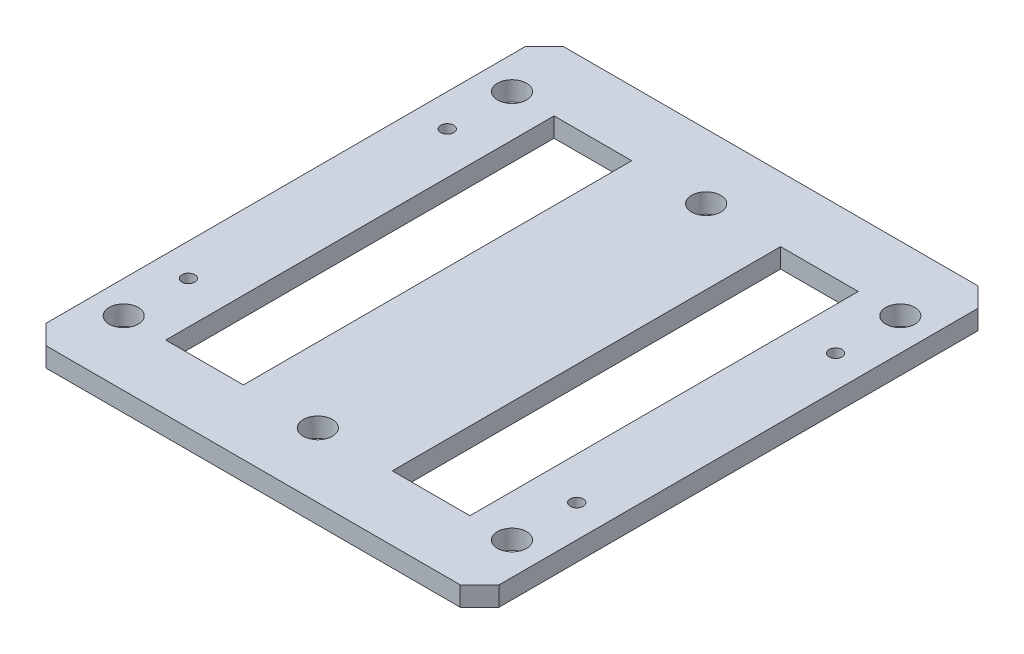
ISO-10303-21;
HEADER;
FILE_DESCRIPTION(('STEP AP214'),'2;1');
FILE_NAME('part.step','',(''),(''),'','','');
FILE_SCHEMA(('AUTOMOTIVE_DESIGN { 1 0 10303 214 1 1 1 1 }'));
ENDSEC;
DATA;
#1=APPLICATION_CONTEXT('core data for automotive mechanical design processes');
#2=APPLICATION_PROTOCOL_DEFINITION('international standard','automotive_design',2000,#1);
#3=PRODUCT_CONTEXT('',#1,'mechanical');
#4=PRODUCT('Part','Part','',(#3));
#5=PRODUCT_RELATED_PRODUCT_CATEGORY('part','',(#4));
#6=PRODUCT_DEFINITION_FORMATION('','',#4);
#7=PRODUCT_DEFINITION_CONTEXT('part definition',#1,'design');
#8=PRODUCT_DEFINITION('design','',#6,#7);
#9=PRODUCT_DEFINITION_SHAPE('','',#8);
#10=(LENGTH_UNIT() NAMED_UNIT(*) SI_UNIT(.MILLI.,.METRE.));
#11=(NAMED_UNIT(*) PLANE_ANGLE_UNIT() SI_UNIT($,.RADIAN.));
#12=(NAMED_UNIT(*) SI_UNIT($,.STERADIAN.) SOLID_ANGLE_UNIT());
#13=UNCERTAINTY_MEASURE_WITH_UNIT(LENGTH_MEASURE(1.E-05),#10,'distance_accuracy_value','');
#14=(GEOMETRIC_REPRESENTATION_CONTEXT(3) GLOBAL_UNCERTAINTY_ASSIGNED_CONTEXT((#13)) GLOBAL_UNIT_ASSIGNED_CONTEXT((#10,
#11,#12)) REPRESENTATION_CONTEXT('',''));
#15=CARTESIAN_POINT('',(0.,0.,0.));
#16=DIRECTION('',(0.,0.,1.));
#17=DIRECTION('',(1.,0.,0.));
#18=AXIS2_PLACEMENT_3D('',#15,#16,#17);
#19=CARTESIAN_POINT('',(0.,0.,80.));
#20=DIRECTION('',(1.,0.,0.));
#21=DIRECTION('',(0.,0.,-1.));
#22=AXIS2_PLACEMENT_3D('',#19,#20,#21);
#23=PLANE('',#22);
#24=DIRECTION('',(0.,-1.,0.));
#25=VECTOR('',#24,1.);
#26=CARTESIAN_POINT('',(0.,0.,3.));
#27=LINE('',#26,#25);
#28=CARTESIAN_POINT('',(0.,12.,3.));
#29=VERTEX_POINT('',#28);
#30=CARTESIAN_POINT('',(0.,9.,3.));
#31=VERTEX_POINT('',#30);
#32=EDGE_CURVE('E199',#29,#31,#27,.T.);
#33=ORIENTED_EDGE('',*,*,#32,.T.);
#34=DIRECTION('',(0.,0.,1.));
#35=VECTOR('',#34,1.);
#36=CARTESIAN_POINT('',(0.,9.,0.));
#37=LINE('',#36,#35);
#38=CARTESIAN_POINT('',(0.,9.,77.));
#39=VERTEX_POINT('',#38);
#40=EDGE_CURVE('E236',#31,#39,#37,.T.);
#41=ORIENTED_EDGE('',*,*,#40,.T.);
#42=DIRECTION('',(0.,1.,0.));
#43=VECTOR('',#42,1.);
#44=CARTESIAN_POINT('',(0.,0.,77.));
#45=LINE('',#44,#43);
#46=CARTESIAN_POINT('',(0.,12.,77.));
#47=VERTEX_POINT('',#46);
#48=EDGE_CURVE('E197',#39,#47,#45,.T.);
#49=ORIENTED_EDGE('',*,*,#48,.T.);
#50=DIRECTION('',(0.,0.,-1.));
#51=VECTOR('',#50,1.);
#52=CARTESIAN_POINT('',(0.,12.,80.));
#53=LINE('',#52,#51);
#54=EDGE_CURVE('E184',#47,#29,#53,.T.);
#55=ORIENTED_EDGE('',*,*,#54,.T.);
#56=EDGE_LOOP('',(#33,#41,#49,#55));
#57=FACE_BOUND('',#56,.T.);
#58=ADVANCED_FACE('F33',(#57),#23,.F.);
#59=CARTESIAN_POINT('',(70.,0.,80.));
#60=DIRECTION('',(-1.,0.,0.));
#61=DIRECTION('',(0.,0.,1.));
#62=AXIS2_PLACEMENT_3D('',#59,#60,#61);
#63=PLANE('',#62);
#64=DIRECTION('',(0.,-1.,0.));
#65=VECTOR('',#64,1.);
#66=CARTESIAN_POINT('',(70.,0.,77.));
#67=LINE('',#66,#65);
#68=CARTESIAN_POINT('',(70.,12.,77.));
#69=VERTEX_POINT('',#68);
#70=CARTESIAN_POINT('',(70.,9.,77.));
#71=VERTEX_POINT('',#70);
#72=EDGE_CURVE('E171',#69,#71,#67,.T.);
#73=ORIENTED_EDGE('',*,*,#72,.T.);
#74=DIRECTION('',(0.,0.,1.));
#75=VECTOR('',#74,1.);
#76=CARTESIAN_POINT('',(70.,9.,0.));
#77=LINE('',#76,#75);
#78=CARTESIAN_POINT('',(70.,9.,3.));
#79=VERTEX_POINT('',#78);
#80=EDGE_CURVE('E152',#79,#71,#77,.T.);
#81=ORIENTED_EDGE('',*,*,#80,.F.);
#82=DIRECTION('',(0.,1.,0.));
#83=VECTOR('',#82,1.);
#84=CARTESIAN_POINT('',(70.,12.,3.));
#85=LINE('',#84,#83);
#86=CARTESIAN_POINT('',(70.,12.,3.));
#87=VERTEX_POINT('',#86);
#88=EDGE_CURVE('E212',#79,#87,#85,.T.);
#89=ORIENTED_EDGE('',*,*,#88,.T.);
#90=DIRECTION('',(0.,0.,-1.));
#91=VECTOR('',#90,1.);
#92=CARTESIAN_POINT('',(70.,12.,80.));
#93=LINE('',#92,#91);
#94=EDGE_CURVE('E188',#69,#87,#93,.T.);
#95=ORIENTED_EDGE('',*,*,#94,.F.);
#96=EDGE_LOOP('',(#73,#81,#89,#95));
#97=FACE_BOUND('',#96,.T.);
#98=ADVANCED_FACE('F217',(#97),#63,.F.);
#99=CARTESIAN_POINT('',(0.,12.,80.));
#100=DIRECTION('',(0.,-1.,0.));
#101=DIRECTION('',(0.,0.,-1.));
#102=AXIS2_PLACEMENT_3D('',#99,#100,#101);
#103=PLANE('',#102);
#104=CARTESIAN_POINT('',(65.,12.,20.));
#105=DIRECTION('',(0.,1.,0.));
#106=DIRECTION('',(0.,0.,-1.));
#107=AXIS2_PLACEMENT_3D('',#104,#105,#106);
#108=CIRCLE('',#107,0.999999999999998);
#109=CARTESIAN_POINT('',(65.,12.,19.));
#110=VERTEX_POINT('',#109);
#111=EDGE_CURVE('E281',#110,#110,#108,.T.);
#112=ORIENTED_EDGE('',*,*,#111,.F.);
#113=EDGE_LOOP('',(#112));
#114=FACE_BOUND('',#113,.T.);
#115=CARTESIAN_POINT('',(65.,12.,60.));
#116=DIRECTION('',(0.,1.,0.));
#117=DIRECTION('',(0.,0.,1.));
#118=AXIS2_PLACEMENT_3D('',#115,#116,#117);
#119=CIRCLE('',#118,0.999999999999998);
#120=CARTESIAN_POINT('',(65.,12.,61.));
#121=VERTEX_POINT('',#120);
#122=EDGE_CURVE('E284',#121,#121,#119,.T.);
#123=ORIENTED_EDGE('',*,*,#122,.F.);
#124=EDGE_LOOP('',(#123));
#125=FACE_BOUND('',#124,.T.);
#126=CARTESIAN_POINT('',(5.,12.,60.));
#127=DIRECTION('',(0.,1.,0.));
#128=DIRECTION('',(0.,0.,-1.));
#129=AXIS2_PLACEMENT_3D('',#126,#127,#128);
#130=CIRCLE('',#129,1.);
#131=CARTESIAN_POINT('',(5.,12.,59.));
#132=VERTEX_POINT('',#131);
#133=EDGE_CURVE('E287',#132,#132,#130,.T.);
#134=ORIENTED_EDGE('',*,*,#133,.F.);
#135=EDGE_LOOP('',(#134));
#136=FACE_BOUND('',#135,.T.);
#137=CARTESIAN_POINT('',(5.,12.,20.));
#138=DIRECTION('',(0.,1.,0.));
#139=DIRECTION('',(0.,0.,1.));
#140=AXIS2_PLACEMENT_3D('',#137,#138,#139);
#141=CIRCLE('',#140,1.);
#142=CARTESIAN_POINT('',(5.,12.,21.));
#143=VERTEX_POINT('',#142);
#144=EDGE_CURVE('E290',#143,#143,#141,.T.);
#145=ORIENTED_EDGE('',*,*,#144,.F.);
#146=EDGE_LOOP('',(#145));
#147=FACE_BOUND('',#146,.T.);
#148=DIRECTION('',(1.,0.,0.));
#149=VECTOR('',#148,1.);
#150=CARTESIAN_POINT('',(11.5,12.,9.99999999999999));
#151=LINE('',#150,#149);
#152=CARTESIAN_POINT('',(11.5,12.,9.99999999999999));
#153=VERTEX_POINT('',#152);
#154=CARTESIAN_POINT('',(23.5,12.,9.99999999999999));
#155=VERTEX_POINT('',#154);
#156=EDGE_CURVE('E293',#153,#155,#151,.T.);
#157=ORIENTED_EDGE('',*,*,#156,.T.);
#158=DIRECTION('',(0.,0.,1.));
#159=VECTOR('',#158,1.);
#160=CARTESIAN_POINT('',(23.5,12.,0.));
#161=LINE('',#160,#159);
#162=CARTESIAN_POINT('',(23.5,12.,70.));
#163=VERTEX_POINT('',#162);
#164=EDGE_CURVE('E193',#155,#163,#161,.T.);
#165=ORIENTED_EDGE('',*,*,#164,.T.);
#166=DIRECTION('',(-1.,0.,0.));
#167=VECTOR('',#166,1.);
#168=CARTESIAN_POINT('',(11.5,12.,70.));
#169=LINE('',#168,#167);
#170=CARTESIAN_POINT('',(11.5,12.,70.));
#171=VERTEX_POINT('',#170);
#172=EDGE_CURVE('E313',#163,#171,#169,.T.);
#173=ORIENTED_EDGE('',*,*,#172,.T.);
#174=DIRECTION('',(0.,0.,1.));
#175=VECTOR('',#174,1.);
#176=CARTESIAN_POINT('',(11.5,12.,0.));
#177=LINE('',#176,#175);
#178=EDGE_CURVE('E190',#153,#171,#177,.T.);
#179=ORIENTED_EDGE('',*,*,#178,.F.);
#180=EDGE_LOOP('',(#157,#165,#173,#179));
#181=FACE_BOUND('',#180,.T.);
#182=DIRECTION('',(1.,0.,0.));
#183=VECTOR('',#182,1.);
#184=CARTESIAN_POINT('',(58.5,12.,9.99999999999999));
#185=LINE('',#184,#183);
#186=CARTESIAN_POINT('',(46.5,12.,9.99999999999999));
#187=VERTEX_POINT('',#186);
#188=CARTESIAN_POINT('',(58.5,12.,9.99999999999999));
#189=VERTEX_POINT('',#188);
#190=EDGE_CURVE('E299',#187,#189,#185,.T.);
#191=ORIENTED_EDGE('',*,*,#190,.T.);
#192=DIRECTION('',(0.,0.,1.));
#193=VECTOR('',#192,1.);
#194=CARTESIAN_POINT('',(58.5,12.,0.));
#195=LINE('',#194,#193);
#196=CARTESIAN_POINT('',(58.5,12.,70.));
#197=VERTEX_POINT('',#196);
#198=EDGE_CURVE('E340',#189,#197,#195,.T.);
#199=ORIENTED_EDGE('',*,*,#198,.T.);
#200=DIRECTION('',(-1.,0.,0.));
#201=VECTOR('',#200,1.);
#202=CARTESIAN_POINT('',(58.5,12.,70.));
#203=LINE('',#202,#201);
#204=CARTESIAN_POINT('',(46.5,12.,70.));
#205=VERTEX_POINT('',#204);
#206=EDGE_CURVE('E306',#197,#205,#203,.T.);
#207=ORIENTED_EDGE('',*,*,#206,.T.);
#208=DIRECTION('',(0.,0.,1.));
#209=VECTOR('',#208,1.);
#210=CARTESIAN_POINT('',(46.5,12.,0.));
#211=LINE('',#210,#209);
#212=EDGE_CURVE('E339',#187,#205,#211,.T.);
#213=ORIENTED_EDGE('',*,*,#212,.F.);
#214=EDGE_LOOP('',(#191,#199,#207,#213));
#215=FACE_BOUND('',#214,.T.);
#216=CARTESIAN_POINT('',(5.,12.,70.));
#217=DIRECTION('',(0.,1.,0.));
#218=DIRECTION('',(0.,0.,-1.));
#219=AXIS2_PLACEMENT_3D('',#216,#217,#218);
#220=CIRCLE('',#219,2.25);
#221=CARTESIAN_POINT('',(5.,12.,67.75));
#222=VERTEX_POINT('',#221);
#223=EDGE_CURVE('E327',#222,#222,#220,.T.);
#224=ORIENTED_EDGE('',*,*,#223,.F.);
#225=EDGE_LOOP('',(#224));
#226=FACE_BOUND('',#225,.T.);
#227=CARTESIAN_POINT('',(5.,12.,10.));
#228=DIRECTION('',(0.,1.,0.));
#229=DIRECTION('',(0.,0.,1.));
#230=AXIS2_PLACEMENT_3D('',#227,#228,#229);
#231=CIRCLE('',#230,2.25);
#232=CARTESIAN_POINT('',(5.,12.,12.25));
#233=VERTEX_POINT('',#232);
#234=EDGE_CURVE('E336',#233,#233,#231,.T.);
#235=ORIENTED_EDGE('',*,*,#234,.F.);
#236=EDGE_LOOP('',(#235));
#237=FACE_BOUND('',#236,.T.);
#238=DIRECTION('',(-1.,0.,0.));
#239=VECTOR('',#238,1.);
#240=CARTESIAN_POINT('',(0.,12.,0.));
#241=LINE('',#240,#239);
#242=CARTESIAN_POINT('',(67.,12.,0.));
#243=VERTEX_POINT('',#242);
#244=CARTESIAN_POINT('',(3.00000000000002,12.,0.));
#245=VERTEX_POINT('',#244);
#246=EDGE_CURVE('E185',#243,#245,#241,.T.);
#247=ORIENTED_EDGE('',*,*,#246,.T.);
#248=DIRECTION('',(-0.707106781186549,0.,0.707106781186546));
#249=VECTOR('',#248,1.);
#250=CARTESIAN_POINT('',(0.,12.,3.));
#251=LINE('',#250,#249);
#252=EDGE_CURVE('E209',#245,#29,#251,.T.);
#253=ORIENTED_EDGE('',*,*,#252,.T.);
#254=ORIENTED_EDGE('',*,*,#54,.F.);
#255=DIRECTION('',(-0.707106781186546,0.,-0.707106781186549));
#256=VECTOR('',#255,1.);
#257=CARTESIAN_POINT('',(3.,12.,80.));
#258=LINE('',#257,#256);
#259=CARTESIAN_POINT('',(3.,12.,80.));
#260=VERTEX_POINT('',#259);
#261=EDGE_CURVE('E176',#47,#260,#258,.F.);
#262=ORIENTED_EDGE('',*,*,#261,.T.);
#263=DIRECTION('',(-1.,0.,0.));
#264=VECTOR('',#263,1.);
#265=CARTESIAN_POINT('',(0.,12.,80.));
#266=LINE('',#265,#264);
#267=CARTESIAN_POINT('',(67.,12.,80.));
#268=VERTEX_POINT('',#267);
#269=EDGE_CURVE('E178',#268,#260,#266,.T.);
#270=ORIENTED_EDGE('',*,*,#269,.F.);
#271=DIRECTION('',(-0.707106781186546,0.,0.707106781186549));
#272=VECTOR('',#271,1.);
#273=CARTESIAN_POINT('',(67.,12.,80.));
#274=LINE('',#273,#272);
#275=EDGE_CURVE('E169',#268,#69,#274,.F.);
#276=ORIENTED_EDGE('',*,*,#275,.T.);
#277=ORIENTED_EDGE('',*,*,#94,.T.);
#278=DIRECTION('',(-0.707106781186549,0.,-0.707106781186546));
#279=VECTOR('',#278,1.);
#280=CARTESIAN_POINT('',(70.,12.,3.));
#281=LINE('',#280,#279);
#282=EDGE_CURVE('E175',#87,#243,#281,.T.);
#283=ORIENTED_EDGE('',*,*,#282,.T.);
#284=EDGE_LOOP('',(#247,#253,#254,#262,#270,#276,#277,#283));
#285=FACE_BOUND('',#284,.T.);
#286=CARTESIAN_POINT('',(35.,12.,70.));
#287=DIRECTION('',(0.,1.,0.));
#288=DIRECTION('',(0.,0.,1.));
#289=AXIS2_PLACEMENT_3D('',#286,#287,#288);
#290=CIRCLE('',#289,2.25);
#291=CARTESIAN_POINT('',(35.,12.,72.25));
#292=VERTEX_POINT('',#291);
#293=EDGE_CURVE('E320',#292,#292,#290,.T.);
#294=ORIENTED_EDGE('',*,*,#293,.F.);
#295=EDGE_LOOP('',(#294));
#296=FACE_BOUND('',#295,.T.);
#297=CARTESIAN_POINT('',(35.,12.,10.));
#298=DIRECTION('',(0.,1.,0.));
#299=DIRECTION('',(0.,0.,1.));
#300=AXIS2_PLACEMENT_3D('',#297,#298,#299);
#301=CIRCLE('',#300,2.25);
#302=CARTESIAN_POINT('',(35.,12.,12.25));
#303=VERTEX_POINT('',#302);
#304=EDGE_CURVE('E324',#303,#303,#301,.T.);
#305=ORIENTED_EDGE('',*,*,#304,.F.);
#306=EDGE_LOOP('',(#305));
#307=FACE_BOUND('',#306,.T.);
#308=CARTESIAN_POINT('',(65.,12.,10.));
#309=DIRECTION('',(0.,1.,0.));
#310=DIRECTION('',(0.,0.,-1.));
#311=AXIS2_PLACEMENT_3D('',#308,#309,#310);
#312=CIRCLE('',#311,2.25);
#313=CARTESIAN_POINT('',(65.,12.,7.75000000000001));
#314=VERTEX_POINT('',#313);
#315=EDGE_CURVE('E330',#314,#314,#312,.T.);
#316=ORIENTED_EDGE('',*,*,#315,.F.);
#317=EDGE_LOOP('',(#316));
#318=FACE_BOUND('',#317,.T.);
#319=CARTESIAN_POINT('',(65.,12.,70.));
#320=DIRECTION('',(0.,1.,0.));
#321=DIRECTION('',(0.,0.,1.));
#322=AXIS2_PLACEMENT_3D('',#319,#320,#321);
#323=CIRCLE('',#322,2.25);
#324=CARTESIAN_POINT('',(65.,12.,72.25));
#325=VERTEX_POINT('',#324);
#326=EDGE_CURVE('E333',#325,#325,#323,.T.);
#327=ORIENTED_EDGE('',*,*,#326,.F.);
#328=EDGE_LOOP('',(#327));
#329=FACE_BOUND('',#328,.T.);
#330=ADVANCED_FACE('F180',(#114,#125,#136,#147,#181,#215,#226,#237,#285,#296,#307,#318,#329),
#103,.F.);
#331=CARTESIAN_POINT('',(0.,0.,80.));
#332=DIRECTION('',(0.,0.,-1.));
#333=DIRECTION('',(-1.,0.,0.));
#334=AXIS2_PLACEMENT_3D('',#331,#332,#333);
#335=PLANE('',#334);
#336=DIRECTION('',(0.,-1.,0.));
#337=VECTOR('',#336,1.);
#338=CARTESIAN_POINT('',(3.,0.,80.));
#339=LINE('',#338,#337);
#340=CARTESIAN_POINT('',(3.,9.,80.));
#341=VERTEX_POINT('',#340);
#342=EDGE_CURVE('E42',#260,#341,#339,.T.);
#343=ORIENTED_EDGE('',*,*,#342,.T.);
#344=DIRECTION('',(-1.,0.,0.));
#345=VECTOR('',#344,1.);
#346=CARTESIAN_POINT('',(0.,9.,80.));
#347=LINE('',#346,#345);
#348=CARTESIAN_POINT('',(67.,9.,80.));
#349=VERTEX_POINT('',#348);
#350=EDGE_CURVE('E149',#349,#341,#347,.T.);
#351=ORIENTED_EDGE('',*,*,#350,.F.);
#352=DIRECTION('',(0.,1.,0.));
#353=VECTOR('',#352,1.);
#354=CARTESIAN_POINT('',(67.,0.,80.));
#355=LINE('',#354,#353);
#356=EDGE_CURVE('E11',#349,#268,#355,.T.);
#357=ORIENTED_EDGE('',*,*,#356,.T.);
#358=ORIENTED_EDGE('',*,*,#269,.T.);
#359=EDGE_LOOP('',(#343,#351,#357,#358));
#360=FACE_BOUND('',#359,.T.);
#361=ADVANCED_FACE('F162',(#360),#335,.F.);
#362=CARTESIAN_POINT('',(0.,0.,0.));
#363=DIRECTION('',(0.,0.,-1.));
#364=DIRECTION('',(-1.,0.,0.));
#365=AXIS2_PLACEMENT_3D('',#362,#363,#364);
#366=PLANE('',#365);
#367=DIRECTION('',(-1.,0.,0.));
#368=VECTOR('',#367,1.);
#369=CARTESIAN_POINT('',(0.,9.,0.));
#370=LINE('',#369,#368);
#371=CARTESIAN_POINT('',(67.,9.,0.));
#372=VERTEX_POINT('',#371);
#373=CARTESIAN_POINT('',(3.00000000000002,9.,0.));
#374=VERTEX_POINT('',#373);
#375=EDGE_CURVE('E166',#372,#374,#370,.T.);
#376=ORIENTED_EDGE('',*,*,#375,.T.);
#377=DIRECTION('',(0.,1.,0.));
#378=VECTOR('',#377,1.);
#379=CARTESIAN_POINT('',(3.00000000000002,12.,0.));
#380=LINE('',#379,#378);
#381=EDGE_CURVE('E205',#374,#245,#380,.T.);
#382=ORIENTED_EDGE('',*,*,#381,.T.);
#383=ORIENTED_EDGE('',*,*,#246,.F.);
#384=DIRECTION('',(0.,-1.,0.));
#385=VECTOR('',#384,1.);
#386=CARTESIAN_POINT('',(67.,0.,0.));
#387=LINE('',#386,#385);
#388=EDGE_CURVE('E202',#243,#372,#387,.T.);
#389=ORIENTED_EDGE('',*,*,#388,.T.);
#390=EDGE_LOOP('',(#376,#382,#383,#389));
#391=FACE_BOUND('',#390,.T.);
#392=ADVANCED_FACE('F226',(#391),#366,.T.);
#393=CARTESIAN_POINT('',(23.5,12.,0.));
#394=DIRECTION('',(1.,0.,0.));
#395=DIRECTION('',(0.,1.,0.));
#396=AXIS2_PLACEMENT_3D('',#393,#394,#395);
#397=PLANE('',#396);
#398=DIRECTION('',(0.,1.,0.));
#399=VECTOR('',#398,1.);
#400=CARTESIAN_POINT('',(23.5,6.,9.99999999999999));
#401=LINE('',#400,#399);
#402=CARTESIAN_POINT('',(23.5,9.,9.99999999999999));
#403=VERTEX_POINT('',#402);
#404=EDGE_CURVE('E297',#403,#155,#401,.T.);
#405=ORIENTED_EDGE('',*,*,#404,.F.);
#406=DIRECTION('',(0.,0.,1.));
#407=VECTOR('',#406,1.);
#408=CARTESIAN_POINT('',(23.5,9.,0.));
#409=LINE('',#408,#407);
#410=CARTESIAN_POINT('',(23.5,9.,70.));
#411=VERTEX_POINT('',#410);
#412=EDGE_CURVE('E57',#403,#411,#409,.T.);
#413=ORIENTED_EDGE('',*,*,#412,.T.);
#414=DIRECTION('',(0.,1.,0.));
#415=VECTOR('',#414,1.);
#416=CARTESIAN_POINT('',(23.5,6.,70.));
#417=LINE('',#416,#415);
#418=EDGE_CURVE('E317',#411,#163,#417,.T.);
#419=ORIENTED_EDGE('',*,*,#418,.T.);
#420=ORIENTED_EDGE('',*,*,#164,.F.);
#421=EDGE_LOOP('',(#405,#413,#419,#420));
#422=FACE_BOUND('',#421,.T.);
#423=ADVANCED_FACE('F364',(#422),#397,.F.);
#424=CARTESIAN_POINT('',(11.5,12.,0.));
#425=DIRECTION('',(-1.,0.,0.));
#426=DIRECTION('',(0.,0.,1.));
#427=AXIS2_PLACEMENT_3D('',#424,#425,#426);
#428=PLANE('',#427);
#429=DIRECTION('',(0.,1.,0.));
#430=VECTOR('',#429,1.);
#431=CARTESIAN_POINT('',(11.5,6.,70.));
#432=LINE('',#431,#430);
#433=CARTESIAN_POINT('',(11.5,9.,70.));
#434=VERTEX_POINT('',#433);
#435=EDGE_CURVE('E318',#434,#171,#432,.T.);
#436=ORIENTED_EDGE('',*,*,#435,.F.);
#437=DIRECTION('',(0.,0.,-1.));
#438=VECTOR('',#437,1.);
#439=CARTESIAN_POINT('',(11.5,9.,0.));
#440=LINE('',#439,#438);
#441=CARTESIAN_POINT('',(11.5,9.,9.99999999999999));
#442=VERTEX_POINT('',#441);
#443=EDGE_CURVE('E249',#434,#442,#440,.T.);
#444=ORIENTED_EDGE('',*,*,#443,.T.);
#445=DIRECTION('',(0.,1.,0.));
#446=VECTOR('',#445,1.);
#447=CARTESIAN_POINT('',(11.5,6.,9.99999999999999));
#448=LINE('',#447,#446);
#449=EDGE_CURVE('E296',#442,#153,#448,.T.);
#450=ORIENTED_EDGE('',*,*,#449,.T.);
#451=ORIENTED_EDGE('',*,*,#178,.T.);
#452=EDGE_LOOP('',(#436,#444,#450,#451));
#453=FACE_BOUND('',#452,.T.);
#454=ADVANCED_FACE('F360',(#453),#428,.F.);
#455=CARTESIAN_POINT('',(58.5,12.,0.));
#456=DIRECTION('',(1.,0.,0.));
#457=DIRECTION('',(0.,0.,-1.));
#458=AXIS2_PLACEMENT_3D('',#455,#456,#457);
#459=PLANE('',#458);
#460=DIRECTION('',(0.,1.,0.));
#461=VECTOR('',#460,1.);
#462=CARTESIAN_POINT('',(58.5,6.,9.99999999999999));
#463=LINE('',#462,#461);
#464=CARTESIAN_POINT('',(58.5,9.,9.99999999999999));
#465=VERTEX_POINT('',#464);
#466=EDGE_CURVE('E304',#465,#189,#463,.T.);
#467=ORIENTED_EDGE('',*,*,#466,.F.);
#468=DIRECTION('',(0.,0.,1.));
#469=VECTOR('',#468,1.);
#470=CARTESIAN_POINT('',(58.5,9.,0.));
#471=LINE('',#470,#469);
#472=CARTESIAN_POINT('',(58.5,9.,70.));
#473=VERTEX_POINT('',#472);
#474=EDGE_CURVE('E49',#465,#473,#471,.T.);
#475=ORIENTED_EDGE('',*,*,#474,.T.);
#476=DIRECTION('',(0.,1.,0.));
#477=VECTOR('',#476,1.);
#478=CARTESIAN_POINT('',(58.5,6.,70.));
#479=LINE('',#478,#477);
#480=EDGE_CURVE('E310',#473,#197,#479,.T.);
#481=ORIENTED_EDGE('',*,*,#480,.T.);
#482=ORIENTED_EDGE('',*,*,#198,.F.);
#483=EDGE_LOOP('',(#467,#475,#481,#482));
#484=FACE_BOUND('',#483,.T.);
#485=ADVANCED_FACE('F371',(#484),#459,.F.);
#486=CARTESIAN_POINT('',(46.5,12.,0.));
#487=DIRECTION('',(-1.,0.,0.));
#488=DIRECTION('',(0.,0.,1.));
#489=AXIS2_PLACEMENT_3D('',#486,#487,#488);
#490=PLANE('',#489);
#491=DIRECTION('',(0.,1.,0.));
#492=VECTOR('',#491,1.);
#493=CARTESIAN_POINT('',(46.5,6.,70.));
#494=LINE('',#493,#492);
#495=CARTESIAN_POINT('',(46.5,9.,70.));
#496=VERTEX_POINT('',#495);
#497=EDGE_CURVE('E311',#496,#205,#494,.T.);
#498=ORIENTED_EDGE('',*,*,#497,.F.);
#499=DIRECTION('',(0.,0.,-1.));
#500=VECTOR('',#499,1.);
#501=CARTESIAN_POINT('',(46.5,9.,0.));
#502=LINE('',#501,#500);
#503=CARTESIAN_POINT('',(46.5,9.,9.99999999999999));
#504=VERTEX_POINT('',#503);
#505=EDGE_CURVE('E257',#496,#504,#502,.T.);
#506=ORIENTED_EDGE('',*,*,#505,.T.);
#507=DIRECTION('',(0.,1.,0.));
#508=VECTOR('',#507,1.);
#509=CARTESIAN_POINT('',(46.5,6.,9.99999999999999));
#510=LINE('',#509,#508);
#511=EDGE_CURVE('E303',#504,#187,#510,.T.);
#512=ORIENTED_EDGE('',*,*,#511,.T.);
#513=ORIENTED_EDGE('',*,*,#212,.T.);
#514=EDGE_LOOP('',(#498,#506,#512,#513));
#515=FACE_BOUND('',#514,.T.);
#516=ADVANCED_FACE('F441',(#515),#490,.F.);
#517=CARTESIAN_POINT('',(5.,0.,10.));
#518=DIRECTION('',(0.,1.,0.));
#519=DIRECTION('',(0.,0.,1.));
#520=AXIS2_PLACEMENT_3D('',#517,#518,#519);
#521=CYLINDRICAL_SURFACE('',#520,2.25);
#522=CARTESIAN_POINT('',(5.,9.,10.));
#523=DIRECTION('',(0.,1.,0.));
#524=DIRECTION('',(0.,0.,1.));
#525=AXIS2_PLACEMENT_3D('',#522,#523,#524);
#526=CIRCLE('',#525,2.25);
#527=CARTESIAN_POINT('',(5.,9.,12.25));
#528=VERTEX_POINT('',#527);
#529=EDGE_CURVE('E278',#528,#528,#526,.F.);
#530=ORIENTED_EDGE('',*,*,#529,.T.);
#531=EDGE_LOOP('',(#530));
#532=FACE_BOUND('',#531,.T.);
#533=ORIENTED_EDGE('',*,*,#234,.T.);
#534=EDGE_LOOP('',(#533));
#535=FACE_BOUND('',#534,.T.);
#536=ADVANCED_FACE('F437',(#532,#535),#521,.F.);
#537=CARTESIAN_POINT('',(65.,0.,70.));
#538=DIRECTION('',(0.,1.,0.));
#539=DIRECTION('',(0.,0.,1.));
#540=AXIS2_PLACEMENT_3D('',#537,#538,#539);
#541=CYLINDRICAL_SURFACE('',#540,2.25);
#542=CARTESIAN_POINT('',(65.,9.,70.));
#543=DIRECTION('',(0.,1.,0.));
#544=DIRECTION('',(0.,0.,1.));
#545=AXIS2_PLACEMENT_3D('',#542,#543,#544);
#546=CIRCLE('',#545,2.25);
#547=CARTESIAN_POINT('',(65.,9.,72.25));
#548=VERTEX_POINT('',#547);
#549=EDGE_CURVE('E275',#548,#548,#546,.F.);
#550=ORIENTED_EDGE('',*,*,#549,.T.);
#551=EDGE_LOOP('',(#550));
#552=FACE_BOUND('',#551,.T.);
#553=ORIENTED_EDGE('',*,*,#326,.T.);
#554=EDGE_LOOP('',(#553));
#555=FACE_BOUND('',#554,.T.);
#556=ADVANCED_FACE('F433',(#552,#555),#541,.F.);
#557=CARTESIAN_POINT('',(65.,0.,10.));
#558=DIRECTION('',(0.,1.,0.));
#559=DIRECTION('',(0.,0.,1.));
#560=AXIS2_PLACEMENT_3D('',#557,#558,#559);
#561=CYLINDRICAL_SURFACE('',#560,2.25);
#562=CARTESIAN_POINT('',(65.,9.,10.));
#563=DIRECTION('',(0.,1.,0.));
#564=DIRECTION('',(0.,0.,1.));
#565=AXIS2_PLACEMENT_3D('',#562,#563,#564);
#566=CIRCLE('',#565,2.25);
#567=CARTESIAN_POINT('',(65.,9.,12.25));
#568=VERTEX_POINT('',#567);
#569=EDGE_CURVE('E272',#568,#568,#566,.F.);
#570=ORIENTED_EDGE('',*,*,#569,.T.);
#571=EDGE_LOOP('',(#570));
#572=FACE_BOUND('',#571,.T.);
#573=ORIENTED_EDGE('',*,*,#315,.T.);
#574=EDGE_LOOP('',(#573));
#575=FACE_BOUND('',#574,.T.);
#576=ADVANCED_FACE('F429',(#572,#575),#561,.F.);
#577=CARTESIAN_POINT('',(5.,0.,70.));
#578=DIRECTION('',(0.,1.,0.));
#579=DIRECTION('',(0.,0.,1.));
#580=AXIS2_PLACEMENT_3D('',#577,#578,#579);
#581=CYLINDRICAL_SURFACE('',#580,2.25);
#582=CARTESIAN_POINT('',(5.,9.,70.));
#583=DIRECTION('',(0.,1.,0.));
#584=DIRECTION('',(0.,0.,1.));
#585=AXIS2_PLACEMENT_3D('',#582,#583,#584);
#586=CIRCLE('',#585,2.25);
#587=CARTESIAN_POINT('',(5.,9.,72.25));
#588=VERTEX_POINT('',#587);
#589=EDGE_CURVE('E269',#588,#588,#586,.F.);
#590=ORIENTED_EDGE('',*,*,#589,.T.);
#591=EDGE_LOOP('',(#590));
#592=FACE_BOUND('',#591,.T.);
#593=ORIENTED_EDGE('',*,*,#223,.T.);
#594=EDGE_LOOP('',(#593));
#595=FACE_BOUND('',#594,.T.);
#596=ADVANCED_FACE('F425',(#592,#595),#581,.F.);
#597=CARTESIAN_POINT('',(35.,0.,10.));
#598=DIRECTION('',(0.,1.,0.));
#599=DIRECTION('',(0.,0.,1.));
#600=AXIS2_PLACEMENT_3D('',#597,#598,#599);
#601=CYLINDRICAL_SURFACE('',#600,2.25);
#602=CARTESIAN_POINT('',(35.,9.,10.));
#603=DIRECTION('',(0.,1.,0.));
#604=DIRECTION('',(0.,0.,1.));
#605=AXIS2_PLACEMENT_3D('',#602,#603,#604);
#606=CIRCLE('',#605,2.25);
#607=CARTESIAN_POINT('',(35.,9.,12.25));
#608=VERTEX_POINT('',#607);
#609=EDGE_CURVE('E266',#608,#608,#606,.F.);
#610=ORIENTED_EDGE('',*,*,#609,.T.);
#611=EDGE_LOOP('',(#610));
#612=FACE_BOUND('',#611,.T.);
#613=ORIENTED_EDGE('',*,*,#304,.T.);
#614=EDGE_LOOP('',(#613));
#615=FACE_BOUND('',#614,.T.);
#616=ADVANCED_FACE('F421',(#612,#615),#601,.F.);
#617=CARTESIAN_POINT('',(35.,0.,70.));
#618=DIRECTION('',(0.,1.,0.));
#619=DIRECTION('',(0.,0.,1.));
#620=AXIS2_PLACEMENT_3D('',#617,#618,#619);
#621=CYLINDRICAL_SURFACE('',#620,2.25);
#622=CARTESIAN_POINT('',(35.,9.,70.));
#623=DIRECTION('',(0.,1.,0.));
#624=DIRECTION('',(0.,0.,1.));
#625=AXIS2_PLACEMENT_3D('',#622,#623,#624);
#626=CIRCLE('',#625,2.25);
#627=CARTESIAN_POINT('',(35.,9.,72.25));
#628=VERTEX_POINT('',#627);
#629=EDGE_CURVE('E263',#628,#628,#626,.F.);
#630=ORIENTED_EDGE('',*,*,#629,.T.);
#631=EDGE_LOOP('',(#630));
#632=FACE_BOUND('',#631,.T.);
#633=ORIENTED_EDGE('',*,*,#293,.T.);
#634=EDGE_LOOP('',(#633));
#635=FACE_BOUND('',#634,.T.);
#636=ADVANCED_FACE('F418',(#632,#635),#621,.F.);
#637=CARTESIAN_POINT('',(11.5,6.,70.));
#638=DIRECTION('',(0.,0.,-1.));
#639=DIRECTION('',(-1.,0.,0.));
#640=AXIS2_PLACEMENT_3D('',#637,#638,#639);
#641=PLANE('',#640);
#642=DIRECTION('',(1.,0.,0.));
#643=VECTOR('',#642,1.);
#644=CARTESIAN_POINT('',(11.5,9.,70.));
#645=LINE('',#644,#643);
#646=EDGE_CURVE('E253',#434,#411,#645,.T.);
#647=ORIENTED_EDGE('',*,*,#646,.F.);
#648=ORIENTED_EDGE('',*,*,#435,.T.);
#649=ORIENTED_EDGE('',*,*,#172,.F.);
#650=ORIENTED_EDGE('',*,*,#418,.F.);
#651=EDGE_LOOP('',(#647,#648,#649,#650));
#652=FACE_BOUND('',#651,.T.);
#653=ADVANCED_FACE('F359',(#652),#641,.T.);
#654=CARTESIAN_POINT('',(58.5,6.,70.));
#655=DIRECTION('',(0.,0.,-1.));
#656=DIRECTION('',(-1.,0.,0.));
#657=AXIS2_PLACEMENT_3D('',#654,#655,#656);
#658=PLANE('',#657);
#659=DIRECTION('',(1.,0.,0.));
#660=VECTOR('',#659,1.);
#661=CARTESIAN_POINT('',(58.5,9.,70.));
#662=LINE('',#661,#660);
#663=EDGE_CURVE('E261',#496,#473,#662,.T.);
#664=ORIENTED_EDGE('',*,*,#663,.F.);
#665=ORIENTED_EDGE('',*,*,#497,.T.);
#666=ORIENTED_EDGE('',*,*,#206,.F.);
#667=ORIENTED_EDGE('',*,*,#480,.F.);
#668=EDGE_LOOP('',(#664,#665,#666,#667));
#669=FACE_BOUND('',#668,.T.);
#670=ADVANCED_FACE('F411',(#669),#658,.T.);
#671=CARTESIAN_POINT('',(58.5,6.,9.99999999999999));
#672=DIRECTION('',(0.,0.,1.));
#673=DIRECTION('',(1.,0.,0.));
#674=AXIS2_PLACEMENT_3D('',#671,#672,#673);
#675=PLANE('',#674);
#676=DIRECTION('',(-1.,0.,0.));
#677=VECTOR('',#676,1.);
#678=CARTESIAN_POINT('',(58.5,9.,9.99999999999999));
#679=LINE('',#678,#677);
#680=EDGE_CURVE('E255',#465,#504,#679,.T.);
#681=ORIENTED_EDGE('',*,*,#680,.F.);
#682=ORIENTED_EDGE('',*,*,#466,.T.);
#683=ORIENTED_EDGE('',*,*,#190,.F.);
#684=ORIENTED_EDGE('',*,*,#511,.F.);
#685=EDGE_LOOP('',(#681,#682,#683,#684));
#686=FACE_BOUND('',#685,.T.);
#687=ADVANCED_FACE('F408',(#686),#675,.T.);
#688=CARTESIAN_POINT('',(11.5,6.,9.99999999999999));
#689=DIRECTION('',(0.,0.,1.));
#690=DIRECTION('',(1.,0.,0.));
#691=AXIS2_PLACEMENT_3D('',#688,#689,#690);
#692=PLANE('',#691);
#693=DIRECTION('',(-1.,0.,0.));
#694=VECTOR('',#693,1.);
#695=CARTESIAN_POINT('',(11.5,9.,9.99999999999999));
#696=LINE('',#695,#694);
#697=EDGE_CURVE('E247',#403,#442,#696,.T.);
#698=ORIENTED_EDGE('',*,*,#697,.F.);
#699=ORIENTED_EDGE('',*,*,#404,.T.);
#700=ORIENTED_EDGE('',*,*,#156,.F.);
#701=ORIENTED_EDGE('',*,*,#449,.F.);
#702=EDGE_LOOP('',(#698,#699,#700,#701));
#703=FACE_BOUND('',#702,.T.);
#704=ADVANCED_FACE('F363',(#703),#692,.T.);
#705=CARTESIAN_POINT('',(0.,0.,3.));
#706=DIRECTION('',(-0.707106781186546,0.,-0.707106781186549));
#707=DIRECTION('',(0.,1.,0.));
#708=AXIS2_PLACEMENT_3D('',#705,#706,#707);
#709=PLANE('',#708);
#710=DIRECTION('',(0.707106781186549,0.,-0.707106781186546));
#711=VECTOR('',#710,1.);
#712=CARTESIAN_POINT('',(0.,9.,3.));
#713=LINE('',#712,#711);
#714=EDGE_CURVE('E232',#31,#374,#713,.T.);
#715=ORIENTED_EDGE('',*,*,#714,.F.);
#716=ORIENTED_EDGE('',*,*,#32,.F.);
#717=ORIENTED_EDGE('',*,*,#252,.F.);
#718=ORIENTED_EDGE('',*,*,#381,.F.);
#719=EDGE_LOOP('',(#715,#716,#717,#718));
#720=FACE_BOUND('',#719,.T.);
#721=ADVANCED_FACE('F230',(#720),#709,.T.);
#722=CARTESIAN_POINT('',(70.,0.,3.));
#723=DIRECTION('',(0.707106781186546,0.,-0.707106781186549));
#724=DIRECTION('',(0.,-1.,0.));
#725=AXIS2_PLACEMENT_3D('',#722,#723,#724);
#726=PLANE('',#725);
#727=DIRECTION('',(0.707106781186549,0.,0.707106781186546));
#728=VECTOR('',#727,1.);
#729=CARTESIAN_POINT('',(70.,9.,3.));
#730=LINE('',#729,#728);
#731=EDGE_CURVE('E157',#372,#79,#730,.T.);
#732=ORIENTED_EDGE('',*,*,#731,.F.);
#733=ORIENTED_EDGE('',*,*,#388,.F.);
#734=ORIENTED_EDGE('',*,*,#282,.F.);
#735=ORIENTED_EDGE('',*,*,#88,.F.);
#736=EDGE_LOOP('',(#732,#733,#734,#735));
#737=FACE_BOUND('',#736,.T.);
#738=ADVANCED_FACE('F221',(#737),#726,.T.);
#739=CARTESIAN_POINT('',(67.,0.,80.));
#740=DIRECTION('',(-0.707106781186549,0.,-0.707106781186546));
#741=DIRECTION('',(0.,1.,0.));
#742=AXIS2_PLACEMENT_3D('',#739,#740,#741);
#743=PLANE('',#742);
#744=DIRECTION('',(0.707106781186546,0.,-0.707106781186549));
#745=VECTOR('',#744,1.);
#746=CARTESIAN_POINT('',(67.,9.,80.));
#747=LINE('',#746,#745);
#748=EDGE_CURVE('E145',#71,#349,#747,.F.);
#749=ORIENTED_EDGE('',*,*,#748,.F.);
#750=ORIENTED_EDGE('',*,*,#72,.F.);
#751=ORIENTED_EDGE('',*,*,#275,.F.);
#752=ORIENTED_EDGE('',*,*,#356,.F.);
#753=EDGE_LOOP('',(#749,#750,#751,#752));
#754=FACE_BOUND('',#753,.T.);
#755=ADVANCED_FACE('F168',(#754),#743,.F.);
#756=CARTESIAN_POINT('',(3.,0.,80.));
#757=DIRECTION('',(0.707106781186549,0.,-0.707106781186546));
#758=DIRECTION('',(0.,-1.,0.));
#759=AXIS2_PLACEMENT_3D('',#756,#757,#758);
#760=PLANE('',#759);
#761=DIRECTION('',(0.707106781186546,0.,0.707106781186549));
#762=VECTOR('',#761,1.);
#763=CARTESIAN_POINT('',(3.,9.,80.));
#764=LINE('',#763,#762);
#765=EDGE_CURVE('E158',#341,#39,#764,.F.);
#766=ORIENTED_EDGE('',*,*,#765,.F.);
#767=ORIENTED_EDGE('',*,*,#342,.F.);
#768=ORIENTED_EDGE('',*,*,#261,.F.);
#769=ORIENTED_EDGE('',*,*,#48,.F.);
#770=EDGE_LOOP('',(#766,#767,#768,#769));
#771=FACE_BOUND('',#770,.T.);
#772=ADVANCED_FACE('F35',(#771),#760,.F.);
#773=CARTESIAN_POINT('',(5.,0.,20.));
#774=DIRECTION('',(0.,1.,0.));
#775=DIRECTION('',(0.,0.,1.));
#776=AXIS2_PLACEMENT_3D('',#773,#774,#775);
#777=CYLINDRICAL_SURFACE('',#776,1.);
#778=CARTESIAN_POINT('',(5.,9.,20.));
#779=DIRECTION('',(0.,1.,0.));
#780=DIRECTION('',(0.,0.,1.));
#781=AXIS2_PLACEMENT_3D('',#778,#779,#780);
#782=CIRCLE('',#781,1.);
#783=CARTESIAN_POINT('',(5.,9.,21.));
#784=VERTEX_POINT('',#783);
#785=EDGE_CURVE('E238',#784,#784,#782,.F.);
#786=ORIENTED_EDGE('',*,*,#785,.T.);
#787=EDGE_LOOP('',(#786));
#788=FACE_BOUND('',#787,.T.);
#789=ORIENTED_EDGE('',*,*,#144,.T.);
#790=EDGE_LOOP('',(#789));
#791=FACE_BOUND('',#790,.T.);
#792=ADVANCED_FACE('F390',(#788,#791),#777,.F.);
#793=CARTESIAN_POINT('',(5.,0.,60.));
#794=DIRECTION('',(0.,1.,0.));
#795=DIRECTION('',(0.,0.,1.));
#796=AXIS2_PLACEMENT_3D('',#793,#794,#795);
#797=CYLINDRICAL_SURFACE('',#796,1.);
#798=CARTESIAN_POINT('',(5.,9.,60.));
#799=DIRECTION('',(0.,1.,0.));
#800=DIRECTION('',(0.,0.,1.));
#801=AXIS2_PLACEMENT_3D('',#798,#799,#800);
#802=CIRCLE('',#801,1.);
#803=CARTESIAN_POINT('',(5.,9.,61.));
#804=VERTEX_POINT('',#803);
#805=EDGE_CURVE('E241',#804,#804,#802,.F.);
#806=ORIENTED_EDGE('',*,*,#805,.T.);
#807=EDGE_LOOP('',(#806));
#808=FACE_BOUND('',#807,.T.);
#809=ORIENTED_EDGE('',*,*,#133,.T.);
#810=EDGE_LOOP('',(#809));
#811=FACE_BOUND('',#810,.T.);
#812=ADVANCED_FACE('F394',(#808,#811),#797,.F.);
#813=CARTESIAN_POINT('',(65.,0.,60.));
#814=DIRECTION('',(0.,1.,0.));
#815=DIRECTION('',(0.,0.,1.));
#816=AXIS2_PLACEMENT_3D('',#813,#814,#815);
#817=CYLINDRICAL_SURFACE('',#816,0.999999999999998);
#818=CARTESIAN_POINT('',(65.,9.,60.));
#819=DIRECTION('',(0.,1.,0.));
#820=DIRECTION('',(0.,0.,1.));
#821=AXIS2_PLACEMENT_3D('',#818,#819,#820);
#822=CIRCLE('',#821,0.999999999999998);
#823=CARTESIAN_POINT('',(65.,9.,61.));
#824=VERTEX_POINT('',#823);
#825=EDGE_CURVE('E684',#824,#824,#822,.F.);
#826=ORIENTED_EDGE('',*,*,#825,.T.);
#827=EDGE_LOOP('',(#826));
#828=FACE_BOUND('',#827,.T.);
#829=ORIENTED_EDGE('',*,*,#122,.T.);
#830=EDGE_LOOP('',(#829));
#831=FACE_BOUND('',#830,.T.);
#832=ADVANCED_FACE('F400',(#828,#831),#817,.F.);
#833=CARTESIAN_POINT('',(65.,0.,20.));
#834=DIRECTION('',(0.,1.,0.));
#835=DIRECTION('',(0.,0.,1.));
#836=AXIS2_PLACEMENT_3D('',#833,#834,#835);
#837=CYLINDRICAL_SURFACE('',#836,0.999999999999998);
#838=CARTESIAN_POINT('',(65.,9.,20.));
#839=DIRECTION('',(0.,1.,0.));
#840=DIRECTION('',(0.,0.,1.));
#841=AXIS2_PLACEMENT_3D('',#838,#839,#840);
#842=CIRCLE('',#841,0.999999999999998);
#843=CARTESIAN_POINT('',(65.,9.,21.));
#844=VERTEX_POINT('',#843);
#845=EDGE_CURVE('E37',#844,#844,#842,.F.);
#846=ORIENTED_EDGE('',*,*,#845,.T.);
#847=EDGE_LOOP('',(#846));
#848=FACE_BOUND('',#847,.T.);
#849=ORIENTED_EDGE('',*,*,#111,.T.);
#850=EDGE_LOOP('',(#849));
#851=FACE_BOUND('',#850,.T.);
#852=ADVANCED_FACE('F480',(#848,#851),#837,.F.);
#853=CARTESIAN_POINT('',(0.,9.,0.));
#854=DIRECTION('',(0.,1.,0.));
#855=DIRECTION('',(0.,0.,1.));
#856=AXIS2_PLACEMENT_3D('',#853,#854,#855);
#857=PLANE('',#856);
#858=ORIENTED_EDGE('',*,*,#549,.F.);
#859=EDGE_LOOP('',(#858));
#860=FACE_BOUND('',#859,.T.);
#861=ORIENTED_EDGE('',*,*,#589,.F.);
#862=EDGE_LOOP('',(#861));
#863=FACE_BOUND('',#862,.T.);
#864=ORIENTED_EDGE('',*,*,#629,.F.);
#865=EDGE_LOOP('',(#864));
#866=FACE_BOUND('',#865,.T.);
#867=ORIENTED_EDGE('',*,*,#663,.T.);
#868=ORIENTED_EDGE('',*,*,#474,.F.);
#869=ORIENTED_EDGE('',*,*,#680,.T.);
#870=ORIENTED_EDGE('',*,*,#505,.F.);
#871=EDGE_LOOP('',(#867,#868,#869,#870));
#872=FACE_BOUND('',#871,.T.);
#873=ORIENTED_EDGE('',*,*,#646,.T.);
#874=ORIENTED_EDGE('',*,*,#412,.F.);
#875=ORIENTED_EDGE('',*,*,#697,.T.);
#876=ORIENTED_EDGE('',*,*,#443,.F.);
#877=EDGE_LOOP('',(#873,#874,#875,#876));
#878=FACE_BOUND('',#877,.T.);
#879=ORIENTED_EDGE('',*,*,#714,.T.);
#880=ORIENTED_EDGE('',*,*,#375,.F.);
#881=ORIENTED_EDGE('',*,*,#731,.T.);
#882=ORIENTED_EDGE('',*,*,#80,.T.);
#883=ORIENTED_EDGE('',*,*,#748,.T.);
#884=ORIENTED_EDGE('',*,*,#350,.T.);
#885=ORIENTED_EDGE('',*,*,#765,.T.);
#886=ORIENTED_EDGE('',*,*,#40,.F.);
#887=EDGE_LOOP('',(#879,#880,#881,#882,#883,#884,#885,#886));
#888=FACE_BOUND('',#887,.T.);
#889=ORIENTED_EDGE('',*,*,#805,.F.);
#890=EDGE_LOOP('',(#889));
#891=FACE_BOUND('',#890,.T.);
#892=ORIENTED_EDGE('',*,*,#845,.F.);
#893=EDGE_LOOP('',(#892));
#894=FACE_BOUND('',#893,.T.);
#895=ORIENTED_EDGE('',*,*,#825,.F.);
#896=EDGE_LOOP('',(#895));
#897=FACE_BOUND('',#896,.T.);
#898=ORIENTED_EDGE('',*,*,#785,.F.);
#899=EDGE_LOOP('',(#898));
#900=FACE_BOUND('',#899,.T.);
#901=ORIENTED_EDGE('',*,*,#609,.F.);
#902=EDGE_LOOP('',(#901));
#903=FACE_BOUND('',#902,.T.);
#904=ORIENTED_EDGE('',*,*,#569,.F.);
#905=EDGE_LOOP('',(#904));
#906=FACE_BOUND('',#905,.T.);
#907=ORIENTED_EDGE('',*,*,#529,.F.);
#908=EDGE_LOOP('',(#907));
#909=FACE_BOUND('',#908,.T.);
#910=ADVANCED_FACE('F147',(#860,#863,#866,#872,#878,#888,#891,#894,#897,#900,#903,#906,#909),
#857,.F.);
#911=CLOSED_SHELL('',(#58,#98,#330,#361,#392,#423,#454,#485,#516,#536,#556,#576,#596,#616,#636,
#653,#670,#687,#704,#721,#738,#755,#772,#792,#812,#832,#852,#910));
#912=MANIFOLD_SOLID_BREP('B2',#911);
#913=ADVANCED_BREP_SHAPE_REPRESENTATION('',(#18,#912),#14);
#914=SHAPE_DEFINITION_REPRESENTATION(#9,#913);
ENDSEC;
END-ISO-10303-21;
